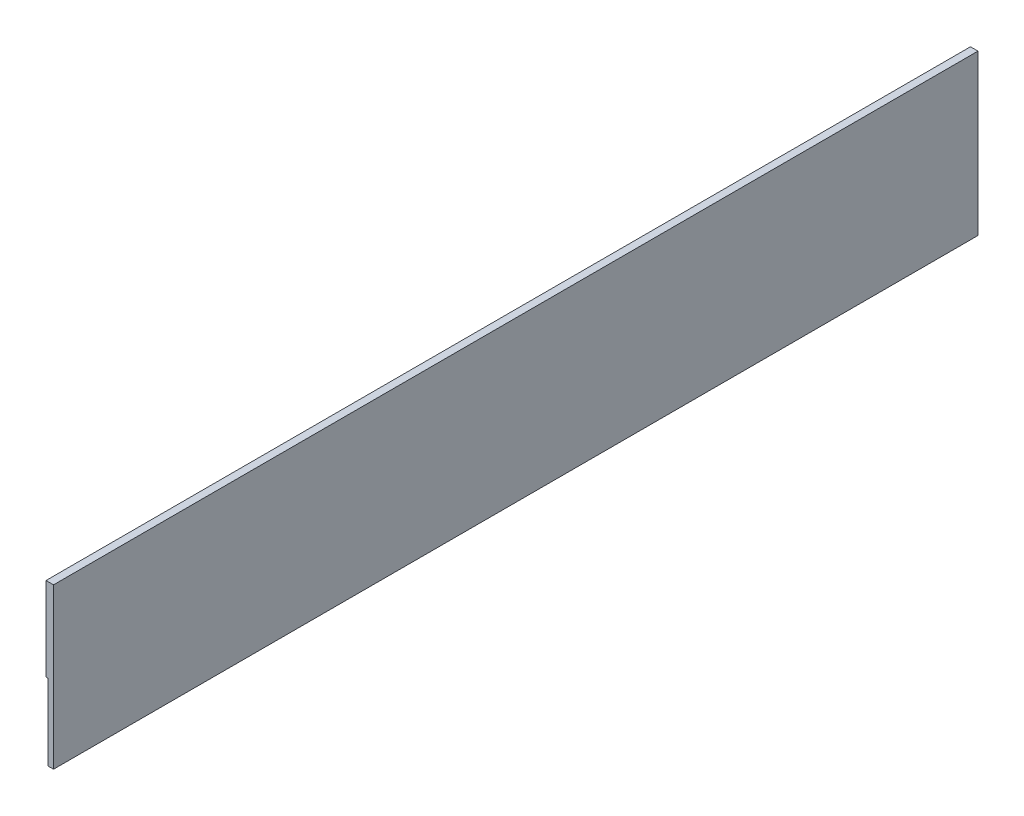
ISO-10303-21;
HEADER;
FILE_DESCRIPTION(('STEP AP214'),'2;1');
FILE_NAME('part.step','',(''),(''),'','','');
FILE_SCHEMA(('AUTOMOTIVE_DESIGN { 1 0 10303 214 1 1 1 1 }'));
ENDSEC;
DATA;
#1=APPLICATION_CONTEXT('core data for automotive mechanical design processes');
#2=APPLICATION_PROTOCOL_DEFINITION('international standard','automotive_design',2000,#1);
#3=PRODUCT_CONTEXT('',#1,'mechanical');
#4=PRODUCT('Part','Part','',(#3));
#5=PRODUCT_RELATED_PRODUCT_CATEGORY('part','',(#4));
#6=PRODUCT_DEFINITION_FORMATION('','',#4);
#7=PRODUCT_DEFINITION_CONTEXT('part definition',#1,'design');
#8=PRODUCT_DEFINITION('design','',#6,#7);
#9=PRODUCT_DEFINITION_SHAPE('','',#8);
#10=(LENGTH_UNIT() NAMED_UNIT(*) SI_UNIT(.MILLI.,.METRE.));
#11=(NAMED_UNIT(*) PLANE_ANGLE_UNIT() SI_UNIT($,.RADIAN.));
#12=(NAMED_UNIT(*) SI_UNIT($,.STERADIAN.) SOLID_ANGLE_UNIT());
#13=UNCERTAINTY_MEASURE_WITH_UNIT(LENGTH_MEASURE(1.E-05),#10,'distance_accuracy_value','');
#14=(GEOMETRIC_REPRESENTATION_CONTEXT(3) GLOBAL_UNCERTAINTY_ASSIGNED_CONTEXT((#13)) GLOBAL_UNIT_ASSIGNED_CONTEXT((#10,
#11,#12)) REPRESENTATION_CONTEXT('',''));
#15=CARTESIAN_POINT('',(0.,0.,0.));
#16=DIRECTION('',(0.,0.,1.));
#17=DIRECTION('',(1.,0.,0.));
#18=AXIS2_PLACEMENT_3D('',#15,#16,#17);
#19=CARTESIAN_POINT('',(76.2,0.,0.));
#20=DIRECTION('',(0.,0.,-1.));
#21=DIRECTION('',(-1.,0.,0.));
#22=AXIS2_PLACEMENT_3D('',#19,#20,#21);
#23=PLANE('',#22);
#24=DIRECTION('',(-1.,0.,0.));
#25=VECTOR('',#24,1.);
#26=CARTESIAN_POINT('',(76.2,2159.,0.));
#27=LINE('',#26,#25);
#28=CARTESIAN_POINT('',(76.2,2159.,0.));
#29=VERTEX_POINT('',#28);
#30=CARTESIAN_POINT('',(-25.4,2159.,0.));
#31=VERTEX_POINT('',#30);
#32=EDGE_CURVE('E129',#29,#31,#27,.T.);
#33=ORIENTED_EDGE('',*,*,#32,.T.);
#34=DIRECTION('',(0.,1.,0.));
#35=VECTOR('',#34,1.);
#36=CARTESIAN_POINT('',(-25.4,1028.7,0.));
#37=LINE('',#36,#35);
#38=CARTESIAN_POINT('',(-25.4,1028.7,0.));
#39=VERTEX_POINT('',#38);
#40=EDGE_CURVE('E105',#39,#31,#37,.T.);
#41=ORIENTED_EDGE('',*,*,#40,.F.);
#42=DIRECTION('',(1.,0.,0.));
#43=VECTOR('',#42,1.);
#44=CARTESIAN_POINT('',(-25.4,1028.7,0.));
#45=LINE('',#44,#43);
#46=CARTESIAN_POINT('',(0.,1028.7,0.));
#47=VERTEX_POINT('',#46);
#48=EDGE_CURVE('E101',#39,#47,#45,.T.);
#49=ORIENTED_EDGE('',*,*,#48,.T.);
#50=DIRECTION('',(0.,-1.,0.));
#51=VECTOR('',#50,1.);
#52=CARTESIAN_POINT('',(0.,0.,0.));
#53=LINE('',#52,#51);
#54=CARTESIAN_POINT('',(0.,0.,0.));
#55=VERTEX_POINT('',#54);
#56=EDGE_CURVE('E118',#47,#55,#53,.T.);
#57=ORIENTED_EDGE('',*,*,#56,.T.);
#58=DIRECTION('',(-1.,0.,0.));
#59=VECTOR('',#58,1.);
#60=CARTESIAN_POINT('',(76.2,0.,0.));
#61=LINE('',#60,#59);
#62=CARTESIAN_POINT('',(76.2,0.,0.));
#63=VERTEX_POINT('',#62);
#64=EDGE_CURVE('E11',#63,#55,#61,.T.);
#65=ORIENTED_EDGE('',*,*,#64,.F.);
#66=DIRECTION('',(0.,-1.,0.));
#67=VECTOR('',#66,1.);
#68=CARTESIAN_POINT('',(76.2,0.,0.));
#69=LINE('',#68,#67);
#70=EDGE_CURVE('E124',#29,#63,#69,.T.);
#71=ORIENTED_EDGE('',*,*,#70,.F.);
#72=EDGE_LOOP('',(#33,#41,#49,#57,#65,#71));
#73=FACE_BOUND('',#72,.T.);
#74=ADVANCED_FACE('F35',(#73),#23,.F.);
#75=CARTESIAN_POINT('',(76.2,0.,0.));
#76=DIRECTION('',(0.,1.,0.));
#77=DIRECTION('',(0.,0.,1.));
#78=AXIS2_PLACEMENT_3D('',#75,#76,#77);
#79=PLANE('',#78);
#80=DIRECTION('',(0.,0.,-1.));
#81=VECTOR('',#80,1.);
#82=CARTESIAN_POINT('',(0.,0.,0.));
#83=LINE('',#82,#81);
#84=CARTESIAN_POINT('',(0.,0.,-12496.8));
#85=VERTEX_POINT('',#84);
#86=EDGE_CURVE('E73',#55,#85,#83,.T.);
#87=ORIENTED_EDGE('',*,*,#86,.T.);
#88=DIRECTION('',(-1.,0.,0.));
#89=VECTOR('',#88,1.);
#90=CARTESIAN_POINT('',(76.2,0.,-12496.8));
#91=LINE('',#90,#89);
#92=CARTESIAN_POINT('',(76.2,0.,-12496.8));
#93=VERTEX_POINT('',#92);
#94=EDGE_CURVE('E42',#93,#85,#91,.T.);
#95=ORIENTED_EDGE('',*,*,#94,.F.);
#96=DIRECTION('',(0.,0.,-1.));
#97=VECTOR('',#96,1.);
#98=CARTESIAN_POINT('',(76.2,0.,0.));
#99=LINE('',#98,#97);
#100=EDGE_CURVE('E78',#63,#93,#99,.T.);
#101=ORIENTED_EDGE('',*,*,#100,.F.);
#102=ORIENTED_EDGE('',*,*,#64,.T.);
#103=EDGE_LOOP('',(#87,#95,#101,#102));
#104=FACE_BOUND('',#103,.T.);
#105=ADVANCED_FACE('F138',(#104),#79,.F.);
#106=CARTESIAN_POINT('',(76.2,0.,-12496.8));
#107=DIRECTION('',(0.,0.,1.));
#108=DIRECTION('',(1.,0.,0.));
#109=AXIS2_PLACEMENT_3D('',#106,#107,#108);
#110=PLANE('',#109);
#111=DIRECTION('',(0.,1.,0.));
#112=VECTOR('',#111,1.);
#113=CARTESIAN_POINT('',(0.,0.,-12496.8));
#114=LINE('',#113,#112);
#115=CARTESIAN_POINT('',(0.,1028.7,-12496.8));
#116=VERTEX_POINT('',#115);
#117=EDGE_CURVE('E117',#85,#116,#114,.T.);
#118=ORIENTED_EDGE('',*,*,#117,.T.);
#119=DIRECTION('',(1.,0.,0.));
#120=VECTOR('',#119,1.);
#121=CARTESIAN_POINT('',(-25.4,1028.7,-12496.8));
#122=LINE('',#121,#120);
#123=CARTESIAN_POINT('',(-25.4,1028.7,-12496.8));
#124=VERTEX_POINT('',#123);
#125=EDGE_CURVE('E99',#124,#116,#122,.T.);
#126=ORIENTED_EDGE('',*,*,#125,.F.);
#127=DIRECTION('',(0.,-1.,0.));
#128=VECTOR('',#127,1.);
#129=CARTESIAN_POINT('',(-25.4,1028.7,-12496.8));
#130=LINE('',#129,#128);
#131=CARTESIAN_POINT('',(-25.4,2159.,-12496.8));
#132=VERTEX_POINT('',#131);
#133=EDGE_CURVE('E106',#132,#124,#130,.T.);
#134=ORIENTED_EDGE('',*,*,#133,.F.);
#135=DIRECTION('',(-1.,0.,0.));
#136=VECTOR('',#135,1.);
#137=CARTESIAN_POINT('',(76.2,2159.,-12496.8));
#138=LINE('',#137,#136);
#139=CARTESIAN_POINT('',(76.2,2159.,-12496.8));
#140=VERTEX_POINT('',#139);
#141=EDGE_CURVE('E134',#140,#132,#138,.T.);
#142=ORIENTED_EDGE('',*,*,#141,.F.);
#143=DIRECTION('',(0.,1.,0.));
#144=VECTOR('',#143,1.);
#145=CARTESIAN_POINT('',(76.2,0.,-12496.8));
#146=LINE('',#145,#144);
#147=EDGE_CURVE('E127',#93,#140,#146,.T.);
#148=ORIENTED_EDGE('',*,*,#147,.F.);
#149=ORIENTED_EDGE('',*,*,#94,.T.);
#150=EDGE_LOOP('',(#118,#126,#134,#142,#148,#149));
#151=FACE_BOUND('',#150,.T.);
#152=ADVANCED_FACE('F116',(#151),#110,.F.);
#153=CARTESIAN_POINT('',(76.2,2159.,0.));
#154=DIRECTION('',(0.,-1.,0.));
#155=DIRECTION('',(0.,0.,-1.));
#156=AXIS2_PLACEMENT_3D('',#153,#154,#155);
#157=PLANE('',#156);
#158=ORIENTED_EDGE('',*,*,#141,.T.);
#159=DIRECTION('',(0.,0.,-1.));
#160=VECTOR('',#159,1.);
#161=CARTESIAN_POINT('',(-25.4,2159.,-12496.8));
#162=LINE('',#161,#160);
#163=EDGE_CURVE('E112',#31,#132,#162,.T.);
#164=ORIENTED_EDGE('',*,*,#163,.F.);
#165=ORIENTED_EDGE('',*,*,#32,.F.);
#166=DIRECTION('',(0.,0.,1.));
#167=VECTOR('',#166,1.);
#168=CARTESIAN_POINT('',(76.2,2159.,0.));
#169=LINE('',#168,#167);
#170=EDGE_CURVE('E58',#140,#29,#169,.T.);
#171=ORIENTED_EDGE('',*,*,#170,.F.);
#172=EDGE_LOOP('',(#158,#164,#165,#171));
#173=FACE_BOUND('',#172,.T.);
#174=ADVANCED_FACE('F144',(#173),#157,.F.);
#175=CARTESIAN_POINT('',(76.2,0.,0.));
#176=DIRECTION('',(-1.,0.,0.));
#177=DIRECTION('',(0.,0.,1.));
#178=AXIS2_PLACEMENT_3D('',#175,#176,#177);
#179=PLANE('',#178);
#180=ORIENTED_EDGE('',*,*,#70,.T.);
#181=ORIENTED_EDGE('',*,*,#100,.T.);
#182=ORIENTED_EDGE('',*,*,#147,.T.);
#183=ORIENTED_EDGE('',*,*,#170,.T.);
#184=EDGE_LOOP('',(#180,#181,#182,#183));
#185=FACE_BOUND('',#184,.T.);
#186=ADVANCED_FACE('F146',(#185),#179,.F.);
#187=CARTESIAN_POINT('',(0.,0.,0.));
#188=DIRECTION('',(-1.,0.,0.));
#189=DIRECTION('',(0.,0.,1.));
#190=AXIS2_PLACEMENT_3D('',#187,#188,#189);
#191=PLANE('',#190);
#192=DIRECTION('',(0.,0.,1.));
#193=VECTOR('',#192,1.);
#194=CARTESIAN_POINT('',(0.,1028.7,-12496.8));
#195=LINE('',#194,#193);
#196=EDGE_CURVE('E49',#116,#47,#195,.T.);
#197=ORIENTED_EDGE('',*,*,#196,.F.);
#198=ORIENTED_EDGE('',*,*,#117,.F.);
#199=ORIENTED_EDGE('',*,*,#86,.F.);
#200=ORIENTED_EDGE('',*,*,#56,.F.);
#201=EDGE_LOOP('',(#197,#198,#199,#200));
#202=FACE_BOUND('',#201,.T.);
#203=ADVANCED_FACE('F136',(#202),#191,.T.);
#204=CARTESIAN_POINT('',(-25.4,1028.7,-12496.8));
#205=DIRECTION('',(0.,1.,0.));
#206=DIRECTION('',(0.,0.,1.));
#207=AXIS2_PLACEMENT_3D('',#204,#205,#206);
#208=PLANE('',#207);
#209=ORIENTED_EDGE('',*,*,#196,.T.);
#210=ORIENTED_EDGE('',*,*,#48,.F.);
#211=DIRECTION('',(0.,0.,1.));
#212=VECTOR('',#211,1.);
#213=CARTESIAN_POINT('',(-25.4,1028.7,-12496.8));
#214=LINE('',#213,#212);
#215=EDGE_CURVE('E95',#124,#39,#214,.T.);
#216=ORIENTED_EDGE('',*,*,#215,.F.);
#217=ORIENTED_EDGE('',*,*,#125,.T.);
#218=EDGE_LOOP('',(#209,#210,#216,#217));
#219=FACE_BOUND('',#218,.T.);
#220=ADVANCED_FACE('F97',(#219),#208,.F.);
#221=CARTESIAN_POINT('',(-25.4,0.,0.));
#222=DIRECTION('',(1.,0.,0.));
#223=DIRECTION('',(0.,0.,-1.));
#224=AXIS2_PLACEMENT_3D('',#221,#222,#223);
#225=PLANE('',#224);
#226=ORIENTED_EDGE('',*,*,#133,.T.);
#227=ORIENTED_EDGE('',*,*,#215,.T.);
#228=ORIENTED_EDGE('',*,*,#40,.T.);
#229=ORIENTED_EDGE('',*,*,#163,.T.);
#230=EDGE_LOOP('',(#226,#227,#228,#229));
#231=FACE_BOUND('',#230,.T.);
#232=ADVANCED_FACE('F110',(#231),#225,.F.);
#233=CLOSED_SHELL('',(#74,#105,#152,#174,#186,#203,#220,#232));
#234=MANIFOLD_SOLID_BREP('B2',#233);
#235=ADVANCED_BREP_SHAPE_REPRESENTATION('',(#18,#234),#14);
#236=SHAPE_DEFINITION_REPRESENTATION(#9,#235);
ENDSEC;
END-ISO-10303-21;
